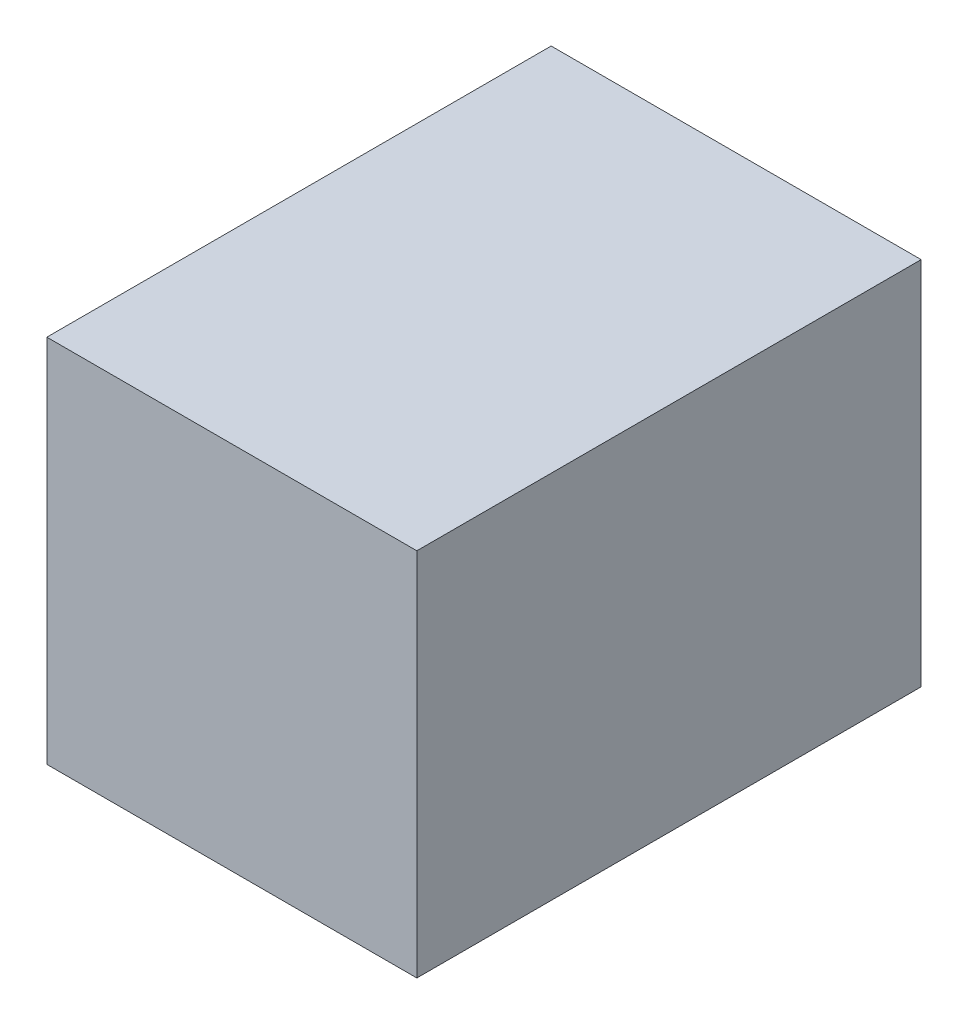
ISO-10303-21;
HEADER;
FILE_DESCRIPTION(('STEP AP214'),'2;1');
FILE_NAME('part.step','',(''),(''),'','','');
FILE_SCHEMA(('AUTOMOTIVE_DESIGN { 1 0 10303 214 1 1 1 1 }'));
ENDSEC;
DATA;
#1=APPLICATION_CONTEXT('core data for automotive mechanical design processes');
#2=APPLICATION_PROTOCOL_DEFINITION('international standard','automotive_design',2000,#1);
#3=PRODUCT_CONTEXT('',#1,'mechanical');
#4=PRODUCT('Part','Part','',(#3));
#5=PRODUCT_RELATED_PRODUCT_CATEGORY('part','',(#4));
#6=PRODUCT_DEFINITION_FORMATION('','',#4);
#7=PRODUCT_DEFINITION_CONTEXT('part definition',#1,'design');
#8=PRODUCT_DEFINITION('design','',#6,#7);
#9=PRODUCT_DEFINITION_SHAPE('','',#8);
#10=(LENGTH_UNIT() NAMED_UNIT(*) SI_UNIT(.MILLI.,.METRE.));
#11=(NAMED_UNIT(*) PLANE_ANGLE_UNIT() SI_UNIT($,.RADIAN.));
#12=(NAMED_UNIT(*) SI_UNIT($,.STERADIAN.) SOLID_ANGLE_UNIT());
#13=UNCERTAINTY_MEASURE_WITH_UNIT(LENGTH_MEASURE(1.E-05),#10,'distance_accuracy_value','');
#14=(GEOMETRIC_REPRESENTATION_CONTEXT(3) GLOBAL_UNCERTAINTY_ASSIGNED_CONTEXT((#13)) GLOBAL_UNIT_ASSIGNED_CONTEXT((#10,
#11,#12)) REPRESENTATION_CONTEXT('',''));
#15=CARTESIAN_POINT('',(0.,0.,0.));
#16=DIRECTION('',(0.,0.,1.));
#17=DIRECTION('',(1.,0.,0.));
#18=AXIS2_PLACEMENT_3D('',#15,#16,#17);
#19=CARTESIAN_POINT('',(28.65,28.65,78.1));
#20=DIRECTION('',(-1.,0.,0.));
#21=DIRECTION('',(0.,-1.,0.));
#22=AXIS2_PLACEMENT_3D('',#19,#20,#21);
#23=PLANE('',#22);
#24=DIRECTION('',(0.,1.,0.));
#25=VECTOR('',#24,1.);
#26=CARTESIAN_POINT('',(28.65,28.65,0.));
#27=LINE('',#26,#25);
#28=CARTESIAN_POINT('',(28.65,-28.65,0.));
#29=VERTEX_POINT('',#28);
#30=CARTESIAN_POINT('',(28.65,28.65,0.));
#31=VERTEX_POINT('',#30);
#32=EDGE_CURVE('E96',#29,#31,#27,.T.);
#33=ORIENTED_EDGE('',*,*,#32,.T.);
#34=DIRECTION('',(0.,0.,-1.));
#35=VECTOR('',#34,1.);
#36=CARTESIAN_POINT('',(28.65,28.65,78.1));
#37=LINE('',#36,#35);
#38=CARTESIAN_POINT('',(28.65,28.65,78.1));
#39=VERTEX_POINT('',#38);
#40=EDGE_CURVE('E11',#39,#31,#37,.T.);
#41=ORIENTED_EDGE('',*,*,#40,.F.);
#42=DIRECTION('',(0.,1.,0.));
#43=VECTOR('',#42,1.);
#44=CARTESIAN_POINT('',(28.65,28.65,78.1));
#45=LINE('',#44,#43);
#46=CARTESIAN_POINT('',(28.65,-28.65,78.1));
#47=VERTEX_POINT('',#46);
#48=EDGE_CURVE('E84',#47,#39,#45,.T.);
#49=ORIENTED_EDGE('',*,*,#48,.F.);
#50=DIRECTION('',(0.,0.,-1.));
#51=VECTOR('',#50,1.);
#52=CARTESIAN_POINT('',(28.65,-28.65,78.1));
#53=LINE('',#52,#51);
#54=EDGE_CURVE('E92',#47,#29,#53,.T.);
#55=ORIENTED_EDGE('',*,*,#54,.T.);
#56=EDGE_LOOP('',(#33,#41,#49,#55));
#57=FACE_BOUND('',#56,.T.);
#58=ADVANCED_FACE('F33',(#57),#23,.F.);
#59=CARTESIAN_POINT('',(-28.65,28.65,78.1));
#60=DIRECTION('',(0.,-1.,0.));
#61=DIRECTION('',(0.,0.,-1.));
#62=AXIS2_PLACEMENT_3D('',#59,#60,#61);
#63=PLANE('',#62);
#64=DIRECTION('',(-1.,0.,0.));
#65=VECTOR('',#64,1.);
#66=CARTESIAN_POINT('',(-28.65,28.65,0.));
#67=LINE('',#66,#65);
#68=CARTESIAN_POINT('',(-28.65,28.65,0.));
#69=VERTEX_POINT('',#68);
#70=EDGE_CURVE('E88',#31,#69,#67,.T.);
#71=ORIENTED_EDGE('',*,*,#70,.T.);
#72=DIRECTION('',(0.,0.,-1.));
#73=VECTOR('',#72,1.);
#74=CARTESIAN_POINT('',(-28.65,28.65,78.1));
#75=LINE('',#74,#73);
#76=CARTESIAN_POINT('',(-28.65,28.65,78.1));
#77=VERTEX_POINT('',#76);
#78=EDGE_CURVE('E41',#77,#69,#75,.T.);
#79=ORIENTED_EDGE('',*,*,#78,.F.);
#80=DIRECTION('',(-1.,0.,0.));
#81=VECTOR('',#80,1.);
#82=CARTESIAN_POINT('',(-28.65,28.65,78.1));
#83=LINE('',#82,#81);
#84=EDGE_CURVE('E79',#39,#77,#83,.T.);
#85=ORIENTED_EDGE('',*,*,#84,.F.);
#86=ORIENTED_EDGE('',*,*,#40,.T.);
#87=EDGE_LOOP('',(#71,#79,#85,#86));
#88=FACE_BOUND('',#87,.T.);
#89=ADVANCED_FACE('F87',(#88),#63,.F.);
#90=CARTESIAN_POINT('',(-28.65,28.65,78.1));
#91=DIRECTION('',(1.,0.,0.));
#92=DIRECTION('',(0.,1.,0.));
#93=AXIS2_PLACEMENT_3D('',#90,#91,#92);
#94=PLANE('',#93);
#95=DIRECTION('',(0.,-1.,0.));
#96=VECTOR('',#95,1.);
#97=CARTESIAN_POINT('',(-28.65,28.65,0.));
#98=LINE('',#97,#96);
#99=CARTESIAN_POINT('',(-28.65,-28.65,0.));
#100=VERTEX_POINT('',#99);
#101=EDGE_CURVE('E66',#69,#100,#98,.T.);
#102=ORIENTED_EDGE('',*,*,#101,.T.);
#103=DIRECTION('',(0.,0.,-1.));
#104=VECTOR('',#103,1.);
#105=CARTESIAN_POINT('',(-28.65,-28.65,78.1));
#106=LINE('',#105,#104);
#107=CARTESIAN_POINT('',(-28.65,-28.65,78.1));
#108=VERTEX_POINT('',#107);
#109=EDGE_CURVE('E89',#108,#100,#106,.T.);
#110=ORIENTED_EDGE('',*,*,#109,.F.);
#111=DIRECTION('',(0.,-1.,0.));
#112=VECTOR('',#111,1.);
#113=CARTESIAN_POINT('',(-28.65,28.65,78.1));
#114=LINE('',#113,#112);
#115=EDGE_CURVE('E82',#77,#108,#114,.T.);
#116=ORIENTED_EDGE('',*,*,#115,.F.);
#117=ORIENTED_EDGE('',*,*,#78,.T.);
#118=EDGE_LOOP('',(#102,#110,#116,#117));
#119=FACE_BOUND('',#118,.T.);
#120=ADVANCED_FACE('F90',(#119),#94,.F.);
#121=CARTESIAN_POINT('',(-28.65,-28.65,78.1));
#122=DIRECTION('',(0.,1.,0.));
#123=DIRECTION('',(0.,0.,1.));
#124=AXIS2_PLACEMENT_3D('',#121,#122,#123);
#125=PLANE('',#124);
#126=DIRECTION('',(1.,0.,0.));
#127=VECTOR('',#126,1.);
#128=CARTESIAN_POINT('',(-28.65,-28.65,0.));
#129=LINE('',#128,#127);
#130=EDGE_CURVE('E72',#100,#29,#129,.T.);
#131=ORIENTED_EDGE('',*,*,#130,.T.);
#132=ORIENTED_EDGE('',*,*,#54,.F.);
#133=DIRECTION('',(1.,0.,0.));
#134=VECTOR('',#133,1.);
#135=CARTESIAN_POINT('',(-28.65,-28.65,78.1));
#136=LINE('',#135,#134);
#137=EDGE_CURVE('E49',#108,#47,#136,.T.);
#138=ORIENTED_EDGE('',*,*,#137,.F.);
#139=ORIENTED_EDGE('',*,*,#109,.T.);
#140=EDGE_LOOP('',(#131,#132,#138,#139));
#141=FACE_BOUND('',#140,.T.);
#142=ADVANCED_FACE('F104',(#141),#125,.F.);
#143=CARTESIAN_POINT('',(0.,0.,78.1));
#144=DIRECTION('',(0.,0.,1.));
#145=DIRECTION('',(1.,0.,0.));
#146=AXIS2_PLACEMENT_3D('',#143,#144,#145);
#147=PLANE('',#146);
#148=ORIENTED_EDGE('',*,*,#48,.T.);
#149=ORIENTED_EDGE('',*,*,#84,.T.);
#150=ORIENTED_EDGE('',*,*,#115,.T.);
#151=ORIENTED_EDGE('',*,*,#137,.T.);
#152=EDGE_LOOP('',(#148,#149,#150,#151));
#153=FACE_BOUND('',#152,.T.);
#154=ADVANCED_FACE('F80',(#153),#147,.T.);
#155=CARTESIAN_POINT('',(0.,0.,0.));
#156=DIRECTION('',(0.,0.,1.));
#157=DIRECTION('',(1.,0.,0.));
#158=AXIS2_PLACEMENT_3D('',#155,#156,#157);
#159=PLANE('',#158);
#160=CARTESIAN_POINT('',(0.,0.,0.));
#161=DIRECTION('',(0.,0.,-1.));
#162=DIRECTION('',(-1.,0.,0.));
#163=AXIS2_PLACEMENT_3D('',#160,#161,#162);
#164=CIRCLE('',#163,3.175);
#165=CARTESIAN_POINT('',(-3.175,0.,0.));
#166=VERTEX_POINT('',#165);
#167=EDGE_CURVE('E110',#166,#166,#164,.T.);
#168=ORIENTED_EDGE('',*,*,#167,.F.);
#169=EDGE_LOOP('',(#168));
#170=FACE_BOUND('',#169,.T.);
#171=ORIENTED_EDGE('',*,*,#32,.F.);
#172=ORIENTED_EDGE('',*,*,#130,.F.);
#173=ORIENTED_EDGE('',*,*,#101,.F.);
#174=ORIENTED_EDGE('',*,*,#70,.F.);
#175=EDGE_LOOP('',(#171,#172,#173,#174));
#176=FACE_BOUND('',#175,.T.);
#177=ADVANCED_FACE('F107',(#170,#176),#159,.F.);
#178=CARTESIAN_POINT('',(0.,0.,10.));
#179=DIRECTION('',(0.,0.,-1.));
#180=DIRECTION('',(-1.,0.,0.));
#181=AXIS2_PLACEMENT_3D('',#178,#179,#180);
#182=CYLINDRICAL_SURFACE('',#181,3.175);
#183=CARTESIAN_POINT('',(0.,0.,10.));
#184=DIRECTION('',(0.,0.,-1.));
#185=DIRECTION('',(-1.,0.,0.));
#186=AXIS2_PLACEMENT_3D('',#183,#184,#185);
#187=CIRCLE('',#186,3.175);
#188=CARTESIAN_POINT('',(-3.175,0.,10.));
#189=VERTEX_POINT('',#188);
#190=EDGE_CURVE('E99',#189,#189,#187,.T.);
#191=ORIENTED_EDGE('',*,*,#190,.F.);
#192=EDGE_LOOP('',(#191));
#193=FACE_BOUND('',#192,.T.);
#194=ORIENTED_EDGE('',*,*,#167,.T.);
#195=EDGE_LOOP('',(#194));
#196=FACE_BOUND('',#195,.T.);
#197=ADVANCED_FACE('F118',(#193,#196),#182,.F.);
#198=CARTESIAN_POINT('',(0.,0.,10.));
#199=DIRECTION('',(0.,0.,-1.));
#200=DIRECTION('',(-1.,0.,0.));
#201=AXIS2_PLACEMENT_3D('',#198,#199,#200);
#202=PLANE('',#201);
#203=ORIENTED_EDGE('',*,*,#190,.T.);
#204=EDGE_LOOP('',(#203));
#205=FACE_BOUND('',#204,.T.);
#206=ADVANCED_FACE('F116',(#205),#202,.T.);
#207=CLOSED_SHELL('',(#58,#89,#120,#142,#154,#177,#197,#206));
#208=MANIFOLD_SOLID_BREP('B2',#207);
#209=ADVANCED_BREP_SHAPE_REPRESENTATION('',(#18,#208),#14);
#210=SHAPE_DEFINITION_REPRESENTATION(#9,#209);
ENDSEC;
END-ISO-10303-21;
